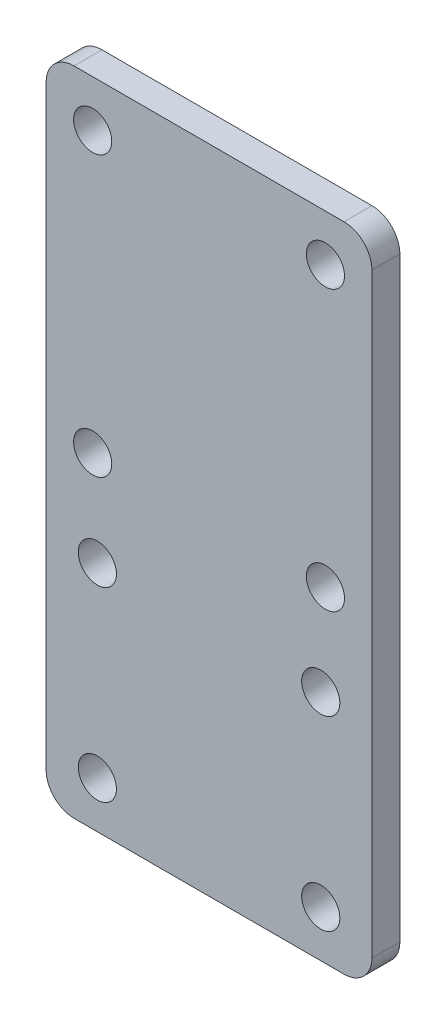
ISO-10303-21;
HEADER;
FILE_DESCRIPTION(('STEP AP214'),'2;1');
FILE_NAME('part.step','',(''),(''),'','','');
FILE_SCHEMA(('AUTOMOTIVE_DESIGN { 1 0 10303 214 1 1 1 1 }'));
ENDSEC;
DATA;
#1=APPLICATION_CONTEXT('core data for automotive mechanical design processes');
#2=APPLICATION_PROTOCOL_DEFINITION('international standard','automotive_design',2000,#1);
#3=PRODUCT_CONTEXT('',#1,'mechanical');
#4=PRODUCT('Part','Part','',(#3));
#5=PRODUCT_RELATED_PRODUCT_CATEGORY('part','',(#4));
#6=PRODUCT_DEFINITION_FORMATION('','',#4);
#7=PRODUCT_DEFINITION_CONTEXT('part definition',#1,'design');
#8=PRODUCT_DEFINITION('design','',#6,#7);
#9=PRODUCT_DEFINITION_SHAPE('','',#8);
#10=(LENGTH_UNIT() NAMED_UNIT(*) SI_UNIT(.MILLI.,.METRE.));
#11=(NAMED_UNIT(*) PLANE_ANGLE_UNIT() SI_UNIT($,.RADIAN.));
#12=(NAMED_UNIT(*) SI_UNIT($,.STERADIAN.) SOLID_ANGLE_UNIT());
#13=UNCERTAINTY_MEASURE_WITH_UNIT(LENGTH_MEASURE(1.E-05),#10,'distance_accuracy_value','');
#14=(GEOMETRIC_REPRESENTATION_CONTEXT(3) GLOBAL_UNCERTAINTY_ASSIGNED_CONTEXT((#13)) GLOBAL_UNIT_ASSIGNED_CONTEXT((#10,
#11,#12)) REPRESENTATION_CONTEXT('',''));
#15=CARTESIAN_POINT('',(0.,0.,0.));
#16=DIRECTION('',(0.,0.,1.));
#17=DIRECTION('',(1.,0.,0.));
#18=AXIS2_PLACEMENT_3D('',#15,#16,#17);
#19=CARTESIAN_POINT('',(0.,0.,3.));
#20=DIRECTION('',(0.,0.,1.));
#21=DIRECTION('',(1.,0.,0.));
#22=AXIS2_PLACEMENT_3D('',#19,#20,#21);
#23=PLANE('',#22);
#24=CARTESIAN_POINT('',(12.,-30.,3.));
#25=DIRECTION('',(0.,0.,1.));
#26=DIRECTION('',(1.,0.,0.));
#27=AXIS2_PLACEMENT_3D('',#24,#25,#26);
#28=CIRCLE('',#27,2.05);
#29=CARTESIAN_POINT('',(14.05,-30.,3.));
#30=VERTEX_POINT('',#29);
#31=EDGE_CURVE('E223',#30,#30,#28,.T.);
#32=ORIENTED_EDGE('',*,*,#31,.F.);
#33=EDGE_LOOP('',(#32));
#34=FACE_BOUND('',#33,.T.);
#35=CARTESIAN_POINT('',(-12.,-10.,3.));
#36=DIRECTION('',(0.,0.,1.));
#37=DIRECTION('',(1.,0.,0.));
#38=AXIS2_PLACEMENT_3D('',#35,#36,#37);
#39=CIRCLE('',#38,2.05);
#40=CARTESIAN_POINT('',(-9.95,-10.,3.));
#41=VERTEX_POINT('',#40);
#42=EDGE_CURVE('E211',#41,#41,#39,.T.);
#43=ORIENTED_EDGE('',*,*,#42,.F.);
#44=EDGE_LOOP('',(#43));
#45=FACE_BOUND('',#44,.T.);
#46=CARTESIAN_POINT('',(12.5,0.,3.));
#47=DIRECTION('',(0.,0.,1.));
#48=DIRECTION('',(1.,0.,0.));
#49=AXIS2_PLACEMENT_3D('',#46,#47,#48);
#50=CIRCLE('',#49,2.05);
#51=CARTESIAN_POINT('',(14.55,0.,3.));
#52=VERTEX_POINT('',#51);
#53=EDGE_CURVE('E199',#52,#52,#50,.T.);
#54=ORIENTED_EDGE('',*,*,#53,.F.);
#55=EDGE_LOOP('',(#54));
#56=FACE_BOUND('',#55,.T.);
#57=CARTESIAN_POINT('',(-12.5,0.,3.));
#58=DIRECTION('',(0.,0.,1.));
#59=DIRECTION('',(1.,0.,0.));
#60=AXIS2_PLACEMENT_3D('',#57,#58,#59);
#61=CIRCLE('',#60,2.05);
#62=CARTESIAN_POINT('',(-10.45,0.,3.));
#63=VERTEX_POINT('',#62);
#64=EDGE_CURVE('E137',#63,#63,#61,.T.);
#65=ORIENTED_EDGE('',*,*,#64,.F.);
#66=EDGE_LOOP('',(#65));
#67=FACE_BOUND('',#66,.T.);
#68=DIRECTION('',(1.,0.,0.));
#69=VECTOR('',#68,1.);
#70=CARTESIAN_POINT('',(-17.5,-35.,3.));
#71=LINE('',#70,#69);
#72=CARTESIAN_POINT('',(-14.5,-35.,3.));
#73=VERTEX_POINT('',#72);
#74=CARTESIAN_POINT('',(14.5,-35.,3.));
#75=VERTEX_POINT('',#74);
#76=EDGE_CURVE('E146',#73,#75,#71,.T.);
#77=ORIENTED_EDGE('',*,*,#76,.T.);
#78=CARTESIAN_POINT('',(14.5,-32.,3.));
#79=DIRECTION('',(0.,0.,1.));
#80=DIRECTION('',(1.,0.,0.));
#81=AXIS2_PLACEMENT_3D('',#78,#79,#80);
#82=CIRCLE('',#81,3.);
#83=CARTESIAN_POINT('',(17.5,-32.,3.));
#84=VERTEX_POINT('',#83);
#85=EDGE_CURVE('E164',#75,#84,#82,.T.);
#86=ORIENTED_EDGE('',*,*,#85,.T.);
#87=DIRECTION('',(0.,1.,0.));
#88=VECTOR('',#87,1.);
#89=CARTESIAN_POINT('',(17.5,35.,3.));
#90=LINE('',#89,#88);
#91=CARTESIAN_POINT('',(17.5,32.,3.));
#92=VERTEX_POINT('',#91);
#93=EDGE_CURVE('E128',#84,#92,#90,.T.);
#94=ORIENTED_EDGE('',*,*,#93,.T.);
#95=CARTESIAN_POINT('',(14.5,32.,3.));
#96=DIRECTION('',(0.,0.,1.));
#97=DIRECTION('',(1.,0.,0.));
#98=AXIS2_PLACEMENT_3D('',#95,#96,#97);
#99=CIRCLE('',#98,3.);
#100=CARTESIAN_POINT('',(14.5,35.,3.));
#101=VERTEX_POINT('',#100);
#102=EDGE_CURVE('E160',#92,#101,#99,.T.);
#103=ORIENTED_EDGE('',*,*,#102,.T.);
#104=DIRECTION('',(-1.,0.,0.));
#105=VECTOR('',#104,1.);
#106=CARTESIAN_POINT('',(-17.5,35.,3.));
#107=LINE('',#106,#105);
#108=CARTESIAN_POINT('',(-14.5,35.,3.));
#109=VERTEX_POINT('',#108);
#110=EDGE_CURVE('E173',#101,#109,#107,.T.);
#111=ORIENTED_EDGE('',*,*,#110,.T.);
#112=CARTESIAN_POINT('',(-14.5,32.,3.));
#113=DIRECTION('',(0.,0.,1.));
#114=DIRECTION('',(1.,0.,0.));
#115=AXIS2_PLACEMENT_3D('',#112,#113,#114);
#116=CIRCLE('',#115,3.);
#117=CARTESIAN_POINT('',(-17.5,32.,3.));
#118=VERTEX_POINT('',#117);
#119=EDGE_CURVE('E63',#109,#118,#116,.T.);
#120=ORIENTED_EDGE('',*,*,#119,.T.);
#121=DIRECTION('',(0.,-1.,0.));
#122=VECTOR('',#121,1.);
#123=CARTESIAN_POINT('',(-17.5,35.,3.));
#124=LINE('',#123,#122);
#125=CARTESIAN_POINT('',(-17.5,-32.,3.));
#126=VERTEX_POINT('',#125);
#127=EDGE_CURVE('E179',#118,#126,#124,.T.);
#128=ORIENTED_EDGE('',*,*,#127,.T.);
#129=CARTESIAN_POINT('',(-14.5,-32.,3.));
#130=DIRECTION('',(0.,0.,1.));
#131=DIRECTION('',(1.,0.,0.));
#132=AXIS2_PLACEMENT_3D('',#129,#130,#131);
#133=CIRCLE('',#132,3.);
#134=EDGE_CURVE('E162',#126,#73,#133,.T.);
#135=ORIENTED_EDGE('',*,*,#134,.T.);
#136=EDGE_LOOP('',(#77,#86,#94,#103,#111,#120,#128,#135));
#137=FACE_BOUND('',#136,.T.);
#138=CARTESIAN_POINT('',(-12.5,30.,3.));
#139=DIRECTION('',(0.,0.,1.));
#140=DIRECTION('',(1.,0.,0.));
#141=AXIS2_PLACEMENT_3D('',#138,#139,#140);
#142=CIRCLE('',#141,2.05);
#143=CARTESIAN_POINT('',(-10.45,30.,3.));
#144=VERTEX_POINT('',#143);
#145=EDGE_CURVE('E194',#144,#144,#142,.T.);
#146=ORIENTED_EDGE('',*,*,#145,.F.);
#147=EDGE_LOOP('',(#146));
#148=FACE_BOUND('',#147,.T.);
#149=CARTESIAN_POINT('',(12.5,30.,3.));
#150=DIRECTION('',(0.,0.,1.));
#151=DIRECTION('',(1.,0.,0.));
#152=AXIS2_PLACEMENT_3D('',#149,#150,#151);
#153=CIRCLE('',#152,2.05);
#154=CARTESIAN_POINT('',(14.55,30.,3.));
#155=VERTEX_POINT('',#154);
#156=EDGE_CURVE('E205',#155,#155,#153,.T.);
#157=ORIENTED_EDGE('',*,*,#156,.F.);
#158=EDGE_LOOP('',(#157));
#159=FACE_BOUND('',#158,.T.);
#160=CARTESIAN_POINT('',(-12.,-30.,3.));
#161=DIRECTION('',(0.,0.,1.));
#162=DIRECTION('',(1.,0.,0.));
#163=AXIS2_PLACEMENT_3D('',#160,#161,#162);
#164=CIRCLE('',#163,2.05);
#165=CARTESIAN_POINT('',(-9.95,-30.,3.));
#166=VERTEX_POINT('',#165);
#167=EDGE_CURVE('E217',#166,#166,#164,.T.);
#168=ORIENTED_EDGE('',*,*,#167,.F.);
#169=EDGE_LOOP('',(#168));
#170=FACE_BOUND('',#169,.T.);
#171=CARTESIAN_POINT('',(12.,-10.,3.));
#172=DIRECTION('',(0.,0.,1.));
#173=DIRECTION('',(1.,0.,0.));
#174=AXIS2_PLACEMENT_3D('',#171,#172,#173);
#175=CIRCLE('',#174,2.05);
#176=CARTESIAN_POINT('',(14.05,-10.,3.));
#177=VERTEX_POINT('',#176);
#178=EDGE_CURVE('E229',#177,#177,#175,.T.);
#179=ORIENTED_EDGE('',*,*,#178,.F.);
#180=EDGE_LOOP('',(#179));
#181=FACE_BOUND('',#180,.T.);
#182=ADVANCED_FACE('F41',(#34,#45,#56,#67,#137,#148,#159,#170,#181),#23,.T.);
#183=CARTESIAN_POINT('',(0.,0.,0.));
#184=DIRECTION('',(0.,0.,1.));
#185=DIRECTION('',(1.,0.,0.));
#186=AXIS2_PLACEMENT_3D('',#183,#184,#185);
#187=PLANE('',#186);
#188=DIRECTION('',(0.,1.,0.));
#189=VECTOR('',#188,1.);
#190=CARTESIAN_POINT('',(17.5,35.,0.));
#191=LINE('',#190,#189);
#192=CARTESIAN_POINT('',(17.5,-32.,0.));
#193=VERTEX_POINT('',#192);
#194=CARTESIAN_POINT('',(17.5,32.,0.));
#195=VERTEX_POINT('',#194);
#196=EDGE_CURVE('E125',#193,#195,#191,.T.);
#197=ORIENTED_EDGE('',*,*,#196,.F.);
#198=CARTESIAN_POINT('',(14.5,-32.,0.));
#199=DIRECTION('',(0.,0.,1.));
#200=DIRECTION('',(1.,0.,0.));
#201=AXIS2_PLACEMENT_3D('',#198,#199,#200);
#202=CIRCLE('',#201,3.);
#203=CARTESIAN_POINT('',(14.5,-35.,0.));
#204=VERTEX_POINT('',#203);
#205=EDGE_CURVE('E108',#193,#204,#202,.F.);
#206=ORIENTED_EDGE('',*,*,#205,.T.);
#207=DIRECTION('',(1.,0.,0.));
#208=VECTOR('',#207,1.);
#209=CARTESIAN_POINT('',(-17.5,-35.,0.));
#210=LINE('',#209,#208);
#211=CARTESIAN_POINT('',(-14.5,-35.,0.));
#212=VERTEX_POINT('',#211);
#213=EDGE_CURVE('E150',#212,#204,#210,.T.);
#214=ORIENTED_EDGE('',*,*,#213,.F.);
#215=CARTESIAN_POINT('',(-14.5,-32.,0.));
#216=DIRECTION('',(0.,0.,1.));
#217=DIRECTION('',(1.,0.,0.));
#218=AXIS2_PLACEMENT_3D('',#215,#216,#217);
#219=CIRCLE('',#218,3.);
#220=CARTESIAN_POINT('',(-17.5,-32.,0.));
#221=VERTEX_POINT('',#220);
#222=EDGE_CURVE('E119',#212,#221,#219,.F.);
#223=ORIENTED_EDGE('',*,*,#222,.T.);
#224=DIRECTION('',(0.,-1.,0.));
#225=VECTOR('',#224,1.);
#226=CARTESIAN_POINT('',(-17.5,35.,0.));
#227=LINE('',#226,#225);
#228=CARTESIAN_POINT('',(-17.5,32.,0.));
#229=VERTEX_POINT('',#228);
#230=EDGE_CURVE('E140',#229,#221,#227,.T.);
#231=ORIENTED_EDGE('',*,*,#230,.F.);
#232=CARTESIAN_POINT('',(-14.5,32.,0.));
#233=DIRECTION('',(0.,0.,1.));
#234=DIRECTION('',(1.,0.,0.));
#235=AXIS2_PLACEMENT_3D('',#232,#233,#234);
#236=CIRCLE('',#235,3.);
#237=CARTESIAN_POINT('',(-14.5,35.,0.));
#238=VERTEX_POINT('',#237);
#239=EDGE_CURVE('E129',#229,#238,#236,.F.);
#240=ORIENTED_EDGE('',*,*,#239,.T.);
#241=DIRECTION('',(-1.,0.,0.));
#242=VECTOR('',#241,1.);
#243=CARTESIAN_POINT('',(-17.5,35.,0.));
#244=LINE('',#243,#242);
#245=CARTESIAN_POINT('',(14.5,35.,0.));
#246=VERTEX_POINT('',#245);
#247=EDGE_CURVE('E136',#246,#238,#244,.T.);
#248=ORIENTED_EDGE('',*,*,#247,.F.);
#249=CARTESIAN_POINT('',(14.5,32.,0.));
#250=DIRECTION('',(0.,0.,1.));
#251=DIRECTION('',(1.,0.,0.));
#252=AXIS2_PLACEMENT_3D('',#249,#250,#251);
#253=CIRCLE('',#252,3.);
#254=EDGE_CURVE('E135',#246,#195,#253,.F.);
#255=ORIENTED_EDGE('',*,*,#254,.T.);
#256=EDGE_LOOP('',(#197,#206,#214,#223,#231,#240,#248,#255));
#257=FACE_BOUND('',#256,.T.);
#258=CARTESIAN_POINT('',(-12.5,0.,0.));
#259=DIRECTION('',(0.,0.,1.));
#260=DIRECTION('',(1.,0.,0.));
#261=AXIS2_PLACEMENT_3D('',#258,#259,#260);
#262=CIRCLE('',#261,2.05);
#263=CARTESIAN_POINT('',(-10.45,0.,0.));
#264=VERTEX_POINT('',#263);
#265=EDGE_CURVE('E143',#264,#264,#262,.T.);
#266=ORIENTED_EDGE('',*,*,#265,.T.);
#267=EDGE_LOOP('',(#266));
#268=FACE_BOUND('',#267,.T.);
#269=CARTESIAN_POINT('',(-12.5,30.,0.));
#270=DIRECTION('',(0.,0.,1.));
#271=DIRECTION('',(1.,0.,0.));
#272=AXIS2_PLACEMENT_3D('',#269,#270,#271);
#273=CIRCLE('',#272,2.05);
#274=CARTESIAN_POINT('',(-10.45,30.,0.));
#275=VERTEX_POINT('',#274);
#276=EDGE_CURVE('E196',#275,#275,#273,.T.);
#277=ORIENTED_EDGE('',*,*,#276,.T.);
#278=EDGE_LOOP('',(#277));
#279=FACE_BOUND('',#278,.T.);
#280=CARTESIAN_POINT('',(12.5,0.,0.));
#281=DIRECTION('',(0.,0.,1.));
#282=DIRECTION('',(1.,0.,0.));
#283=AXIS2_PLACEMENT_3D('',#280,#281,#282);
#284=CIRCLE('',#283,2.05);
#285=CARTESIAN_POINT('',(14.55,0.,0.));
#286=VERTEX_POINT('',#285);
#287=EDGE_CURVE('E202',#286,#286,#284,.T.);
#288=ORIENTED_EDGE('',*,*,#287,.T.);
#289=EDGE_LOOP('',(#288));
#290=FACE_BOUND('',#289,.T.);
#291=CARTESIAN_POINT('',(12.5,30.,0.));
#292=DIRECTION('',(0.,0.,1.));
#293=DIRECTION('',(1.,0.,0.));
#294=AXIS2_PLACEMENT_3D('',#291,#292,#293);
#295=CIRCLE('',#294,2.05);
#296=CARTESIAN_POINT('',(14.55,30.,0.));
#297=VERTEX_POINT('',#296);
#298=EDGE_CURVE('E208',#297,#297,#295,.T.);
#299=ORIENTED_EDGE('',*,*,#298,.T.);
#300=EDGE_LOOP('',(#299));
#301=FACE_BOUND('',#300,.T.);
#302=CARTESIAN_POINT('',(-12.,-10.,0.));
#303=DIRECTION('',(0.,0.,1.));
#304=DIRECTION('',(1.,0.,0.));
#305=AXIS2_PLACEMENT_3D('',#302,#303,#304);
#306=CIRCLE('',#305,2.05);
#307=CARTESIAN_POINT('',(-9.95,-10.,0.));
#308=VERTEX_POINT('',#307);
#309=EDGE_CURVE('E214',#308,#308,#306,.T.);
#310=ORIENTED_EDGE('',*,*,#309,.T.);
#311=EDGE_LOOP('',(#310));
#312=FACE_BOUND('',#311,.T.);
#313=CARTESIAN_POINT('',(-12.,-30.,0.));
#314=DIRECTION('',(0.,0.,1.));
#315=DIRECTION('',(1.,0.,0.));
#316=AXIS2_PLACEMENT_3D('',#313,#314,#315);
#317=CIRCLE('',#316,2.05);
#318=CARTESIAN_POINT('',(-9.95,-30.,0.));
#319=VERTEX_POINT('',#318);
#320=EDGE_CURVE('E220',#319,#319,#317,.T.);
#321=ORIENTED_EDGE('',*,*,#320,.T.);
#322=EDGE_LOOP('',(#321));
#323=FACE_BOUND('',#322,.T.);
#324=CARTESIAN_POINT('',(12.,-30.,0.));
#325=DIRECTION('',(0.,0.,1.));
#326=DIRECTION('',(1.,0.,0.));
#327=AXIS2_PLACEMENT_3D('',#324,#325,#326);
#328=CIRCLE('',#327,2.05);
#329=CARTESIAN_POINT('',(14.05,-30.,0.));
#330=VERTEX_POINT('',#329);
#331=EDGE_CURVE('E226',#330,#330,#328,.T.);
#332=ORIENTED_EDGE('',*,*,#331,.T.);
#333=EDGE_LOOP('',(#332));
#334=FACE_BOUND('',#333,.T.);
#335=CARTESIAN_POINT('',(12.,-10.,0.));
#336=DIRECTION('',(0.,0.,1.));
#337=DIRECTION('',(1.,0.,0.));
#338=AXIS2_PLACEMENT_3D('',#335,#336,#337);
#339=CIRCLE('',#338,2.05);
#340=CARTESIAN_POINT('',(14.05,-10.,0.));
#341=VERTEX_POINT('',#340);
#342=EDGE_CURVE('E232',#341,#341,#339,.T.);
#343=ORIENTED_EDGE('',*,*,#342,.T.);
#344=EDGE_LOOP('',(#343));
#345=FACE_BOUND('',#344,.T.);
#346=ADVANCED_FACE('F132',(#257,#268,#279,#290,#301,#312,#323,#334,#345),#187,.F.);
#347=CARTESIAN_POINT('',(17.5,35.,3.));
#348=DIRECTION('',(-1.,0.,0.));
#349=DIRECTION('',(0.,-1.,0.));
#350=AXIS2_PLACEMENT_3D('',#347,#348,#349);
#351=PLANE('',#350);
#352=ORIENTED_EDGE('',*,*,#93,.F.);
#353=DIRECTION('',(0.,0.,-1.));
#354=VECTOR('',#353,1.);
#355=CARTESIAN_POINT('',(17.5,-32.,3.));
#356=LINE('',#355,#354);
#357=EDGE_CURVE('E112',#84,#193,#356,.T.);
#358=ORIENTED_EDGE('',*,*,#357,.T.);
#359=ORIENTED_EDGE('',*,*,#196,.T.);
#360=DIRECTION('',(0.,0.,-1.));
#361=VECTOR('',#360,1.);
#362=CARTESIAN_POINT('',(17.5,32.,3.));
#363=LINE('',#362,#361);
#364=EDGE_CURVE('E130',#195,#92,#363,.F.);
#365=ORIENTED_EDGE('',*,*,#364,.T.);
#366=EDGE_LOOP('',(#352,#358,#359,#365));
#367=FACE_BOUND('',#366,.T.);
#368=ADVANCED_FACE('F124',(#367),#351,.F.);
#369=CARTESIAN_POINT('',(-17.5,35.,3.));
#370=DIRECTION('',(0.,-1.,0.));
#371=DIRECTION('',(0.,0.,-1.));
#372=AXIS2_PLACEMENT_3D('',#369,#370,#371);
#373=PLANE('',#372);
#374=ORIENTED_EDGE('',*,*,#110,.F.);
#375=DIRECTION('',(0.,0.,-1.));
#376=VECTOR('',#375,1.);
#377=CARTESIAN_POINT('',(14.5,35.,3.));
#378=LINE('',#377,#376);
#379=EDGE_CURVE('E11',#101,#246,#378,.T.);
#380=ORIENTED_EDGE('',*,*,#379,.T.);
#381=ORIENTED_EDGE('',*,*,#247,.T.);
#382=DIRECTION('',(0.,0.,-1.));
#383=VECTOR('',#382,1.);
#384=CARTESIAN_POINT('',(-14.5,35.,3.));
#385=LINE('',#384,#383);
#386=EDGE_CURVE('E49',#238,#109,#385,.F.);
#387=ORIENTED_EDGE('',*,*,#386,.T.);
#388=EDGE_LOOP('',(#374,#380,#381,#387));
#389=FACE_BOUND('',#388,.T.);
#390=ADVANCED_FACE('F172',(#389),#373,.F.);
#391=CARTESIAN_POINT('',(-17.5,35.,3.));
#392=DIRECTION('',(1.,0.,0.));
#393=DIRECTION('',(0.,1.,0.));
#394=AXIS2_PLACEMENT_3D('',#391,#392,#393);
#395=PLANE('',#394);
#396=ORIENTED_EDGE('',*,*,#230,.T.);
#397=DIRECTION('',(0.,0.,-1.));
#398=VECTOR('',#397,1.);
#399=CARTESIAN_POINT('',(-17.5,-32.,3.));
#400=LINE('',#399,#398);
#401=EDGE_CURVE('E56',#221,#126,#400,.F.);
#402=ORIENTED_EDGE('',*,*,#401,.T.);
#403=ORIENTED_EDGE('',*,*,#127,.F.);
#404=DIRECTION('',(0.,0.,-1.));
#405=VECTOR('',#404,1.);
#406=CARTESIAN_POINT('',(-17.5,32.,3.));
#407=LINE('',#406,#405);
#408=EDGE_CURVE('E166',#118,#229,#407,.T.);
#409=ORIENTED_EDGE('',*,*,#408,.T.);
#410=EDGE_LOOP('',(#396,#402,#403,#409));
#411=FACE_BOUND('',#410,.T.);
#412=ADVANCED_FACE('F183',(#411),#395,.F.);
#413=CARTESIAN_POINT('',(-17.5,-35.,3.));
#414=DIRECTION('',(0.,1.,0.));
#415=DIRECTION('',(0.,0.,1.));
#416=AXIS2_PLACEMENT_3D('',#413,#414,#415);
#417=PLANE('',#416);
#418=ORIENTED_EDGE('',*,*,#213,.T.);
#419=DIRECTION('',(0.,0.,-1.));
#420=VECTOR('',#419,1.);
#421=CARTESIAN_POINT('',(14.5,-35.,3.));
#422=LINE('',#421,#420);
#423=EDGE_CURVE('E113',#204,#75,#422,.F.);
#424=ORIENTED_EDGE('',*,*,#423,.T.);
#425=ORIENTED_EDGE('',*,*,#76,.F.);
#426=DIRECTION('',(0.,0.,-1.));
#427=VECTOR('',#426,1.);
#428=CARTESIAN_POINT('',(-14.5,-35.,3.));
#429=LINE('',#428,#427);
#430=EDGE_CURVE('E118',#73,#212,#429,.T.);
#431=ORIENTED_EDGE('',*,*,#430,.T.);
#432=EDGE_LOOP('',(#418,#424,#425,#431));
#433=FACE_BOUND('',#432,.T.);
#434=ADVANCED_FACE('F190',(#433),#417,.F.);
#435=CARTESIAN_POINT('',(-12.5,0.,3.));
#436=DIRECTION('',(0.,0.,-1.));
#437=DIRECTION('',(-1.,0.,0.));
#438=AXIS2_PLACEMENT_3D('',#435,#436,#437);
#439=CYLINDRICAL_SURFACE('',#438,2.05);
#440=ORIENTED_EDGE('',*,*,#64,.T.);
#441=EDGE_LOOP('',(#440));
#442=FACE_BOUND('',#441,.T.);
#443=ORIENTED_EDGE('',*,*,#265,.F.);
#444=EDGE_LOOP('',(#443));
#445=FACE_BOUND('',#444,.T.);
#446=ADVANCED_FACE('F252',(#442,#445),#439,.F.);
#447=CARTESIAN_POINT('',(-12.5,30.,3.));
#448=DIRECTION('',(0.,0.,-1.));
#449=DIRECTION('',(-1.,0.,0.));
#450=AXIS2_PLACEMENT_3D('',#447,#448,#449);
#451=CYLINDRICAL_SURFACE('',#450,2.05);
#452=ORIENTED_EDGE('',*,*,#145,.T.);
#453=EDGE_LOOP('',(#452));
#454=FACE_BOUND('',#453,.T.);
#455=ORIENTED_EDGE('',*,*,#276,.F.);
#456=EDGE_LOOP('',(#455));
#457=FACE_BOUND('',#456,.T.);
#458=ADVANCED_FACE('F348',(#454,#457),#451,.F.);
#459=CARTESIAN_POINT('',(12.5,0.,3.));
#460=DIRECTION('',(0.,0.,-1.));
#461=DIRECTION('',(-1.,0.,0.));
#462=AXIS2_PLACEMENT_3D('',#459,#460,#461);
#463=CYLINDRICAL_SURFACE('',#462,2.05);
#464=ORIENTED_EDGE('',*,*,#53,.T.);
#465=EDGE_LOOP('',(#464));
#466=FACE_BOUND('',#465,.T.);
#467=ORIENTED_EDGE('',*,*,#287,.F.);
#468=EDGE_LOOP('',(#467));
#469=FACE_BOUND('',#468,.T.);
#470=ADVANCED_FACE('F338',(#466,#469),#463,.F.);
#471=CARTESIAN_POINT('',(12.5,30.,3.));
#472=DIRECTION('',(0.,0.,-1.));
#473=DIRECTION('',(-1.,0.,0.));
#474=AXIS2_PLACEMENT_3D('',#471,#472,#473);
#475=CYLINDRICAL_SURFACE('',#474,2.05);
#476=ORIENTED_EDGE('',*,*,#156,.T.);
#477=EDGE_LOOP('',(#476));
#478=FACE_BOUND('',#477,.T.);
#479=ORIENTED_EDGE('',*,*,#298,.F.);
#480=EDGE_LOOP('',(#479));
#481=FACE_BOUND('',#480,.T.);
#482=ADVANCED_FACE('F328',(#478,#481),#475,.F.);
#483=CARTESIAN_POINT('',(-12.,-10.,3.));
#484=DIRECTION('',(0.,0.,-1.));
#485=DIRECTION('',(-1.,0.,0.));
#486=AXIS2_PLACEMENT_3D('',#483,#484,#485);
#487=CYLINDRICAL_SURFACE('',#486,2.05);
#488=ORIENTED_EDGE('',*,*,#42,.T.);
#489=EDGE_LOOP('',(#488));
#490=FACE_BOUND('',#489,.T.);
#491=ORIENTED_EDGE('',*,*,#309,.F.);
#492=EDGE_LOOP('',(#491));
#493=FACE_BOUND('',#492,.T.);
#494=ADVANCED_FACE('F318',(#490,#493),#487,.F.);
#495=CARTESIAN_POINT('',(-12.,-30.,3.));
#496=DIRECTION('',(0.,0.,-1.));
#497=DIRECTION('',(-1.,0.,0.));
#498=AXIS2_PLACEMENT_3D('',#495,#496,#497);
#499=CYLINDRICAL_SURFACE('',#498,2.05);
#500=ORIENTED_EDGE('',*,*,#167,.T.);
#501=EDGE_LOOP('',(#500));
#502=FACE_BOUND('',#501,.T.);
#503=ORIENTED_EDGE('',*,*,#320,.F.);
#504=EDGE_LOOP('',(#503));
#505=FACE_BOUND('',#504,.T.);
#506=ADVANCED_FACE('F308',(#502,#505),#499,.F.);
#507=CARTESIAN_POINT('',(12.,-30.,3.));
#508=DIRECTION('',(0.,0.,-1.));
#509=DIRECTION('',(-1.,0.,0.));
#510=AXIS2_PLACEMENT_3D('',#507,#508,#509);
#511=CYLINDRICAL_SURFACE('',#510,2.05);
#512=ORIENTED_EDGE('',*,*,#31,.T.);
#513=EDGE_LOOP('',(#512));
#514=FACE_BOUND('',#513,.T.);
#515=ORIENTED_EDGE('',*,*,#331,.F.);
#516=EDGE_LOOP('',(#515));
#517=FACE_BOUND('',#516,.T.);
#518=ADVANCED_FACE('F299',(#514,#517),#511,.F.);
#519=CARTESIAN_POINT('',(12.,-10.,3.));
#520=DIRECTION('',(0.,0.,-1.));
#521=DIRECTION('',(-1.,0.,0.));
#522=AXIS2_PLACEMENT_3D('',#519,#520,#521);
#523=CYLINDRICAL_SURFACE('',#522,2.05);
#524=ORIENTED_EDGE('',*,*,#178,.T.);
#525=EDGE_LOOP('',(#524));
#526=FACE_BOUND('',#525,.T.);
#527=ORIENTED_EDGE('',*,*,#342,.F.);
#528=EDGE_LOOP('',(#527));
#529=FACE_BOUND('',#528,.T.);
#530=ADVANCED_FACE('F238',(#526,#529),#523,.F.);
#531=CARTESIAN_POINT('',(14.5,-32.,3.));
#532=DIRECTION('',(0.,0.,-1.));
#533=DIRECTION('',(-1.,0.,0.));
#534=AXIS2_PLACEMENT_3D('',#531,#532,#533);
#535=CYLINDRICAL_SURFACE('',#534,3.);
#536=ORIENTED_EDGE('',*,*,#85,.F.);
#537=ORIENTED_EDGE('',*,*,#423,.F.);
#538=ORIENTED_EDGE('',*,*,#205,.F.);
#539=ORIENTED_EDGE('',*,*,#357,.F.);
#540=EDGE_LOOP('',(#536,#537,#538,#539));
#541=FACE_BOUND('',#540,.T.);
#542=ADVANCED_FACE('F111',(#541),#535,.T.);
#543=CARTESIAN_POINT('',(-14.5,-32.,3.));
#544=DIRECTION('',(0.,0.,-1.));
#545=DIRECTION('',(-1.,0.,0.));
#546=AXIS2_PLACEMENT_3D('',#543,#544,#545);
#547=CYLINDRICAL_SURFACE('',#546,3.);
#548=ORIENTED_EDGE('',*,*,#134,.F.);
#549=ORIENTED_EDGE('',*,*,#401,.F.);
#550=ORIENTED_EDGE('',*,*,#222,.F.);
#551=ORIENTED_EDGE('',*,*,#430,.F.);
#552=EDGE_LOOP('',(#548,#549,#550,#551));
#553=FACE_BOUND('',#552,.T.);
#554=ADVANCED_FACE('F187',(#553),#547,.T.);
#555=CARTESIAN_POINT('',(14.5,32.,3.));
#556=DIRECTION('',(0.,0.,-1.));
#557=DIRECTION('',(-1.,0.,0.));
#558=AXIS2_PLACEMENT_3D('',#555,#556,#557);
#559=CYLINDRICAL_SURFACE('',#558,3.);
#560=ORIENTED_EDGE('',*,*,#102,.F.);
#561=ORIENTED_EDGE('',*,*,#364,.F.);
#562=ORIENTED_EDGE('',*,*,#254,.F.);
#563=ORIENTED_EDGE('',*,*,#379,.F.);
#564=EDGE_LOOP('',(#560,#561,#562,#563));
#565=FACE_BOUND('',#564,.T.);
#566=ADVANCED_FACE('F266',(#565),#559,.T.);
#567=CARTESIAN_POINT('',(-14.5,32.,3.));
#568=DIRECTION('',(0.,0.,-1.));
#569=DIRECTION('',(-1.,0.,0.));
#570=AXIS2_PLACEMENT_3D('',#567,#568,#569);
#571=CYLINDRICAL_SURFACE('',#570,3.);
#572=ORIENTED_EDGE('',*,*,#119,.F.);
#573=ORIENTED_EDGE('',*,*,#386,.F.);
#574=ORIENTED_EDGE('',*,*,#239,.F.);
#575=ORIENTED_EDGE('',*,*,#408,.F.);
#576=EDGE_LOOP('',(#572,#573,#574,#575));
#577=FACE_BOUND('',#576,.T.);
#578=ADVANCED_FACE('F43',(#577),#571,.T.);
#579=CLOSED_SHELL('',(#182,#346,#368,#390,#412,#434,#446,#458,#470,#482,#494,#506,#518,#530,
#542,#554,#566,#578));
#580=MANIFOLD_SOLID_BREP('B2',#579);
#581=ADVANCED_BREP_SHAPE_REPRESENTATION('',(#18,#580),#14);
#582=SHAPE_DEFINITION_REPRESENTATION(#9,#581);
ENDSEC;
END-ISO-10303-21;
